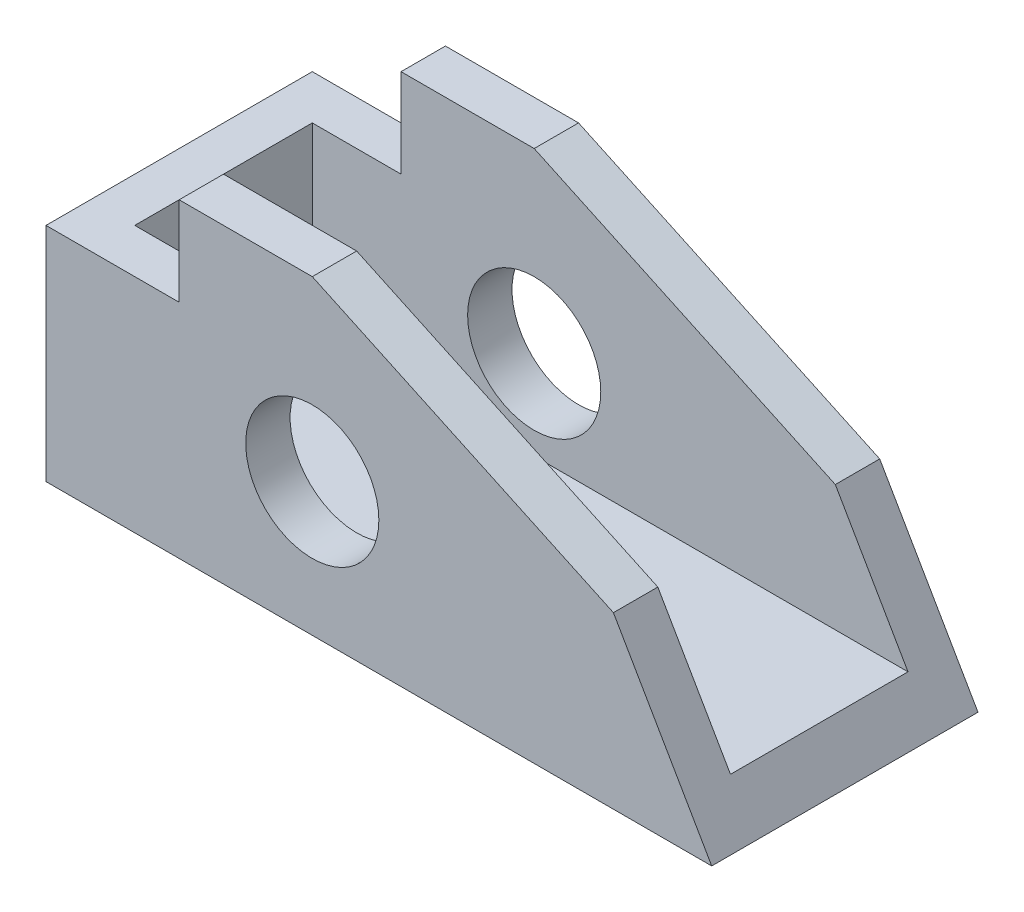
ISO-10303-21;
HEADER;
FILE_DESCRIPTION(('STEP AP214'),'2;1');
FILE_NAME('part.step','',(''),(''),'','','');
FILE_SCHEMA(('AUTOMOTIVE_DESIGN { 1 0 10303 214 1 1 1 1 }'));
ENDSEC;
DATA;
#1=APPLICATION_CONTEXT('core data for automotive mechanical design processes');
#2=APPLICATION_PROTOCOL_DEFINITION('international standard','automotive_design',2000,#1);
#3=PRODUCT_CONTEXT('',#1,'mechanical');
#4=PRODUCT('Part','Part','',(#3));
#5=PRODUCT_RELATED_PRODUCT_CATEGORY('part','',(#4));
#6=PRODUCT_DEFINITION_FORMATION('','',#4);
#7=PRODUCT_DEFINITION_CONTEXT('part definition',#1,'design');
#8=PRODUCT_DEFINITION('design','',#6,#7);
#9=PRODUCT_DEFINITION_SHAPE('','',#8);
#10=(LENGTH_UNIT() NAMED_UNIT(*) SI_UNIT(.MILLI.,.METRE.));
#11=(NAMED_UNIT(*) PLANE_ANGLE_UNIT() SI_UNIT($,.RADIAN.));
#12=(NAMED_UNIT(*) SI_UNIT($,.STERADIAN.) SOLID_ANGLE_UNIT());
#13=UNCERTAINTY_MEASURE_WITH_UNIT(LENGTH_MEASURE(1.E-05),#10,'distance_accuracy_value','');
#14=(GEOMETRIC_REPRESENTATION_CONTEXT(3) GLOBAL_UNCERTAINTY_ASSIGNED_CONTEXT((#13)) GLOBAL_UNIT_ASSIGNED_CONTEXT((#10,
#11,#12)) REPRESENTATION_CONTEXT('',''));
#15=CARTESIAN_POINT('',(0.,0.,0.));
#16=DIRECTION('',(0.,0.,1.));
#17=DIRECTION('',(1.,0.,0.));
#18=AXIS2_PLACEMENT_3D('',#15,#16,#17);
#19=CARTESIAN_POINT('',(0.,44.45,0.));
#20=DIRECTION('',(0.,-1.,0.));
#21=DIRECTION('',(0.,0.,-1.));
#22=AXIS2_PLACEMENT_3D('',#19,#20,#21);
#23=PLANE('',#22);
#24=DIRECTION('',(0.,0.,-1.));
#25=VECTOR('',#24,1.);
#26=CARTESIAN_POINT('',(19.05,44.45,-38.1));
#27=LINE('',#26,#25);
#28=CARTESIAN_POINT('',(19.05,44.45,-31.75));
#29=VERTEX_POINT('',#28);
#30=CARTESIAN_POINT('',(19.05,44.45,-38.1));
#31=VERTEX_POINT('',#30);
#32=EDGE_CURVE('E199',#29,#31,#27,.T.);
#33=ORIENTED_EDGE('',*,*,#32,.F.);
#34=DIRECTION('',(-1.,0.,0.));
#35=VECTOR('',#34,1.);
#36=CARTESIAN_POINT('',(6.35,44.45,-31.75));
#37=LINE('',#36,#35);
#38=CARTESIAN_POINT('',(38.1,44.45,-31.75));
#39=VERTEX_POINT('',#38);
#40=EDGE_CURVE('E154',#39,#29,#37,.T.);
#41=ORIENTED_EDGE('',*,*,#40,.F.);
#42=DIRECTION('',(0.,0.,1.));
#43=VECTOR('',#42,1.);
#44=CARTESIAN_POINT('',(38.1,44.45,-38.101));
#45=LINE('',#44,#43);
#46=CARTESIAN_POINT('',(38.1,44.45,-38.1));
#47=VERTEX_POINT('',#46);
#48=EDGE_CURVE('E194',#47,#39,#45,.T.);
#49=ORIENTED_EDGE('',*,*,#48,.F.);
#50=DIRECTION('',(-1.,0.,0.));
#51=VECTOR('',#50,1.);
#52=CARTESIAN_POINT('',(0.,44.45,-38.1));
#53=LINE('',#52,#51);
#54=EDGE_CURVE('E229',#47,#31,#53,.T.);
#55=ORIENTED_EDGE('',*,*,#54,.T.);
#56=EDGE_LOOP('',(#33,#41,#49,#55));
#57=FACE_BOUND('',#56,.T.);
#58=ADVANCED_FACE('F33',(#57),#23,.F.);
#59=CARTESIAN_POINT('',(38.1,19.05,0.));
#60=DIRECTION('',(0.,0.,1.));
#61=DIRECTION('',(1.,0.,0.));
#62=AXIS2_PLACEMENT_3D('',#59,#60,#61);
#63=CYLINDRICAL_SURFACE('',#62,9.525);
#64=CARTESIAN_POINT('',(38.1,19.05,-31.75));
#65=DIRECTION('',(0.,0.,-1.));
#66=DIRECTION('',(-1.,0.,0.));
#67=AXIS2_PLACEMENT_3D('',#64,#65,#66);
#68=CIRCLE('',#67,9.525);
#69=CARTESIAN_POINT('',(28.575,19.05,-31.75));
#70=VERTEX_POINT('',#69);
#71=EDGE_CURVE('E181',#70,#70,#68,.F.);
#72=ORIENTED_EDGE('',*,*,#71,.T.);
#73=EDGE_LOOP('',(#72));
#74=FACE_BOUND('',#73,.T.);
#75=CARTESIAN_POINT('',(38.1,19.05,-38.1));
#76=DIRECTION('',(0.,0.,1.));
#77=DIRECTION('',(1.,0.,0.));
#78=AXIS2_PLACEMENT_3D('',#75,#76,#77);
#79=CIRCLE('',#78,9.52499999999999);
#80=CARTESIAN_POINT('',(47.625,19.05,-38.1));
#81=VERTEX_POINT('',#80);
#82=EDGE_CURVE('E222',#81,#81,#79,.T.);
#83=ORIENTED_EDGE('',*,*,#82,.F.);
#84=EDGE_LOOP('',(#83));
#85=FACE_BOUND('',#84,.T.);
#86=ADVANCED_FACE('F306',(#74,#85),#63,.F.);
#87=CARTESIAN_POINT('',(19.05,31.75,-38.1));
#88=DIRECTION('',(1.,0.,0.));
#89=DIRECTION('',(0.,0.,-1.));
#90=AXIS2_PLACEMENT_3D('',#87,#88,#89);
#91=PLANE('',#90);
#92=DIRECTION('',(0.,0.,-1.));
#93=VECTOR('',#92,1.);
#94=CARTESIAN_POINT('',(19.05,31.75,-38.1));
#95=LINE('',#94,#93);
#96=CARTESIAN_POINT('',(19.05,31.75,-31.75));
#97=VERTEX_POINT('',#96);
#98=CARTESIAN_POINT('',(19.05,31.75,-38.1));
#99=VERTEX_POINT('',#98);
#100=EDGE_CURVE('E206',#97,#99,#95,.T.);
#101=ORIENTED_EDGE('',*,*,#100,.F.);
#102=DIRECTION('',(0.,1.,0.));
#103=VECTOR('',#102,1.);
#104=CARTESIAN_POINT('',(19.05,31.75,-31.75));
#105=LINE('',#104,#103);
#106=EDGE_CURVE('E178',#97,#29,#105,.T.);
#107=ORIENTED_EDGE('',*,*,#106,.T.);
#108=ORIENTED_EDGE('',*,*,#32,.T.);
#109=DIRECTION('',(0.,1.,0.));
#110=VECTOR('',#109,1.);
#111=CARTESIAN_POINT('',(19.05,31.75,-38.1));
#112=LINE('',#111,#110);
#113=EDGE_CURVE('E215',#99,#31,#112,.T.);
#114=ORIENTED_EDGE('',*,*,#113,.F.);
#115=EDGE_LOOP('',(#101,#107,#108,#114));
#116=FACE_BOUND('',#115,.T.);
#117=ADVANCED_FACE('F268',(#116),#91,.F.);
#118=CARTESIAN_POINT('',(38.1,44.45,-38.101));
#119=DIRECTION('',(-0.4226182617407,-0.90630778703665,0.));
#120=DIRECTION('',(0.90630778703665,-0.4226182617407,0.));
#121=AXIS2_PLACEMENT_3D('',#118,#119,#120);
#122=PLANE('',#121);
#123=ORIENTED_EDGE('',*,*,#48,.T.);
#124=DIRECTION('',(0.90630778703665,-0.4226182617407,0.));
#125=VECTOR('',#124,1.);
#126=CARTESIAN_POINT('',(38.1,44.45,-31.75));
#127=LINE('',#126,#125);
#128=CARTESIAN_POINT('',(81.1867065548134,24.3583387688133,-31.75));
#129=VERTEX_POINT('',#128);
#130=EDGE_CURVE('E173',#39,#129,#127,.T.);
#131=ORIENTED_EDGE('',*,*,#130,.T.);
#132=DIRECTION('',(0.,0.,1.));
#133=VECTOR('',#132,1.);
#134=CARTESIAN_POINT('',(81.1867065548134,24.3583387688133,-38.101));
#135=LINE('',#134,#133);
#136=CARTESIAN_POINT('',(81.1867065548134,24.3583387688133,-38.1));
#137=VERTEX_POINT('',#136);
#138=EDGE_CURVE('E185',#137,#129,#135,.T.);
#139=ORIENTED_EDGE('',*,*,#138,.F.);
#140=DIRECTION('',(-0.90630778703665,0.4226182617407,0.));
#141=VECTOR('',#140,1.);
#142=CARTESIAN_POINT('',(38.1,44.45,-38.1));
#143=LINE('',#142,#141);
#144=EDGE_CURVE('E197',#137,#47,#143,.T.);
#145=ORIENTED_EDGE('',*,*,#144,.T.);
#146=EDGE_LOOP('',(#123,#131,#139,#145));
#147=FACE_BOUND('',#146,.T.);
#148=ADVANCED_FACE('F255',(#147),#122,.F.);
#149=CARTESIAN_POINT('',(0.,44.45,0.));
#150=DIRECTION('',(1.,0.,0.));
#151=DIRECTION('',(0.,0.,-1.));
#152=AXIS2_PLACEMENT_3D('',#149,#150,#151);
#153=PLANE('',#152);
#154=DIRECTION('',(0.,0.,1.));
#155=VECTOR('',#154,1.);
#156=CARTESIAN_POINT('',(0.,31.75,-38.1));
#157=LINE('',#156,#155);
#158=CARTESIAN_POINT('',(0.,31.75,-38.1));
#159=VERTEX_POINT('',#158);
#160=CARTESIAN_POINT('',(0.,31.75,0.));
#161=VERTEX_POINT('',#160);
#162=EDGE_CURVE('E200',#159,#161,#157,.T.);
#163=ORIENTED_EDGE('',*,*,#162,.F.);
#164=DIRECTION('',(0.,-1.,0.));
#165=VECTOR('',#164,1.);
#166=CARTESIAN_POINT('',(0.,44.45,-38.1));
#167=LINE('',#166,#165);
#168=CARTESIAN_POINT('',(0.,0.,-38.1));
#169=VERTEX_POINT('',#168);
#170=EDGE_CURVE('E233',#159,#169,#167,.T.);
#171=ORIENTED_EDGE('',*,*,#170,.T.);
#172=DIRECTION('',(0.,0.,1.));
#173=VECTOR('',#172,1.);
#174=CARTESIAN_POINT('',(0.,0.,0.));
#175=LINE('',#174,#173);
#176=CARTESIAN_POINT('',(0.,0.,0.));
#177=VERTEX_POINT('',#176);
#178=EDGE_CURVE('E225',#169,#177,#175,.T.);
#179=ORIENTED_EDGE('',*,*,#178,.T.);
#180=DIRECTION('',(0.,-1.,0.));
#181=VECTOR('',#180,1.);
#182=CARTESIAN_POINT('',(0.,44.45,0.));
#183=LINE('',#182,#181);
#184=EDGE_CURVE('E244',#161,#177,#183,.T.);
#185=ORIENTED_EDGE('',*,*,#184,.F.);
#186=EDGE_LOOP('',(#163,#171,#179,#185));
#187=FACE_BOUND('',#186,.T.);
#188=ADVANCED_FACE('F35',(#187),#153,.F.);
#189=CARTESIAN_POINT('',(0.,44.45,0.));
#190=DIRECTION('',(0.,0.,-1.));
#191=DIRECTION('',(-1.,0.,0.));
#192=AXIS2_PLACEMENT_3D('',#189,#190,#191);
#193=PLANE('',#192);
#194=CARTESIAN_POINT('',(38.1,19.05,0.));
#195=DIRECTION('',(0.,0.,1.));
#196=DIRECTION('',(1.,0.,0.));
#197=AXIS2_PLACEMENT_3D('',#194,#195,#196);
#198=CIRCLE('',#197,9.525);
#199=CARTESIAN_POINT('',(47.625,19.05,0.));
#200=VERTEX_POINT('',#199);
#201=EDGE_CURVE('E218',#200,#200,#198,.T.);
#202=ORIENTED_EDGE('',*,*,#201,.F.);
#203=EDGE_LOOP('',(#202));
#204=FACE_BOUND('',#203,.T.);
#205=DIRECTION('',(1.,0.,0.));
#206=VECTOR('',#205,1.);
#207=CARTESIAN_POINT('',(0.,0.,0.));
#208=LINE('',#207,#206);
#209=CARTESIAN_POINT('',(95.25,0.,0.));
#210=VERTEX_POINT('',#209);
#211=EDGE_CURVE('E236',#177,#210,#208,.T.);
#212=ORIENTED_EDGE('',*,*,#211,.T.);
#213=DIRECTION('',(0.500000000000004,-0.866025403784436,0.));
#214=VECTOR('',#213,1.);
#215=CARTESIAN_POINT('',(95.25,0.,0.));
#216=LINE('',#215,#214);
#217=CARTESIAN_POINT('',(81.1867065548134,24.3583387688133,0.));
#218=VERTEX_POINT('',#217);
#219=EDGE_CURVE('E188',#218,#210,#216,.T.);
#220=ORIENTED_EDGE('',*,*,#219,.F.);
#221=DIRECTION('',(0.906307787036649,-0.4226182617407,0.));
#222=VECTOR('',#221,1.);
#223=CARTESIAN_POINT('',(38.1,44.45,0.));
#224=LINE('',#223,#222);
#225=CARTESIAN_POINT('',(38.1,44.45,0.));
#226=VERTEX_POINT('',#225);
#227=EDGE_CURVE('E190',#226,#218,#224,.T.);
#228=ORIENTED_EDGE('',*,*,#227,.F.);
#229=DIRECTION('',(1.,0.,0.));
#230=VECTOR('',#229,1.);
#231=CARTESIAN_POINT('',(0.,44.45,0.));
#232=LINE('',#231,#230);
#233=CARTESIAN_POINT('',(19.05,44.45,0.));
#234=VERTEX_POINT('',#233);
#235=EDGE_CURVE('E226',#234,#226,#232,.T.);
#236=ORIENTED_EDGE('',*,*,#235,.F.);
#237=DIRECTION('',(0.,1.,0.));
#238=VECTOR('',#237,1.);
#239=CARTESIAN_POINT('',(19.05,31.75,0.));
#240=LINE('',#239,#238);
#241=CARTESIAN_POINT('',(19.05,31.75,0.));
#242=VERTEX_POINT('',#241);
#243=EDGE_CURVE('E212',#242,#234,#240,.T.);
#244=ORIENTED_EDGE('',*,*,#243,.F.);
#245=DIRECTION('',(1.,0.,0.));
#246=VECTOR('',#245,1.);
#247=CARTESIAN_POINT('',(0.,31.75,0.));
#248=LINE('',#247,#246);
#249=EDGE_CURVE('E202',#161,#242,#248,.T.);
#250=ORIENTED_EDGE('',*,*,#249,.F.);
#251=ORIENTED_EDGE('',*,*,#184,.T.);
#252=EDGE_LOOP('',(#212,#220,#228,#236,#244,#250,#251));
#253=FACE_BOUND('',#252,.T.);
#254=ADVANCED_FACE('F283',(#204,#253),#193,.F.);
#255=CARTESIAN_POINT('',(0.,44.45,-38.1));
#256=DIRECTION('',(0.,0.,1.));
#257=DIRECTION('',(1.,0.,0.));
#258=AXIS2_PLACEMENT_3D('',#255,#256,#257);
#259=PLANE('',#258);
#260=ORIENTED_EDGE('',*,*,#82,.T.);
#261=EDGE_LOOP('',(#260));
#262=FACE_BOUND('',#261,.T.);
#263=ORIENTED_EDGE('',*,*,#144,.F.);
#264=DIRECTION('',(-0.500000000000004,0.866025403784436,0.));
#265=VECTOR('',#264,1.);
#266=CARTESIAN_POINT('',(95.25,0.,-38.1));
#267=LINE('',#266,#265);
#268=CARTESIAN_POINT('',(95.25,0.,-38.1));
#269=VERTEX_POINT('',#268);
#270=EDGE_CURVE('E56',#269,#137,#267,.T.);
#271=ORIENTED_EDGE('',*,*,#270,.F.);
#272=DIRECTION('',(-1.,0.,0.));
#273=VECTOR('',#272,1.);
#274=CARTESIAN_POINT('',(0.,0.,-38.1));
#275=LINE('',#274,#273);
#276=EDGE_CURVE('E230',#269,#169,#275,.T.);
#277=ORIENTED_EDGE('',*,*,#276,.T.);
#278=ORIENTED_EDGE('',*,*,#170,.F.);
#279=DIRECTION('',(-1.,0.,0.));
#280=VECTOR('',#279,1.);
#281=CARTESIAN_POINT('',(0.,31.75,-38.1));
#282=LINE('',#281,#280);
#283=EDGE_CURVE('E210',#99,#159,#282,.T.);
#284=ORIENTED_EDGE('',*,*,#283,.F.);
#285=ORIENTED_EDGE('',*,*,#113,.T.);
#286=ORIENTED_EDGE('',*,*,#54,.F.);
#287=EDGE_LOOP('',(#263,#271,#277,#278,#284,#285,#286));
#288=FACE_BOUND('',#287,.T.);
#289=ADVANCED_FACE('F262',(#262,#288),#259,.F.);
#290=CARTESIAN_POINT('',(38.1,44.45,-6.35));
#291=VERTEX_POINT('',#290);
#292=EDGE_CURVE('E193',#291,#226,#45,.T.);
#293=ORIENTED_EDGE('',*,*,#292,.F.);
#294=DIRECTION('',(1.,0.,0.));
#295=VECTOR('',#294,1.);
#296=CARTESIAN_POINT('',(6.35,44.45,-6.35));
#297=LINE('',#296,#295);
#298=CARTESIAN_POINT('',(19.05,44.45,-6.35));
#299=VERTEX_POINT('',#298);
#300=EDGE_CURVE('E156',#299,#291,#297,.T.);
#301=ORIENTED_EDGE('',*,*,#300,.F.);
#302=EDGE_CURVE('E203',#234,#299,#27,.T.);
#303=ORIENTED_EDGE('',*,*,#302,.F.);
#304=ORIENTED_EDGE('',*,*,#235,.T.);
#305=EDGE_LOOP('',(#293,#301,#303,#304));
#306=FACE_BOUND('',#305,.T.);
#307=ADVANCED_FACE('F280',(#306),#23,.F.);
#308=CARTESIAN_POINT('',(0.,0.,0.));
#309=DIRECTION('',(0.,-1.,0.));
#310=DIRECTION('',(0.,0.,-1.));
#311=AXIS2_PLACEMENT_3D('',#308,#309,#310);
#312=PLANE('',#311);
#313=ORIENTED_EDGE('',*,*,#178,.F.);
#314=ORIENTED_EDGE('',*,*,#276,.F.);
#315=DIRECTION('',(0.,0.,-1.));
#316=VECTOR('',#315,1.);
#317=CARTESIAN_POINT('',(95.25,0.,0.));
#318=LINE('',#317,#316);
#319=EDGE_CURVE('E239',#210,#269,#318,.T.);
#320=ORIENTED_EDGE('',*,*,#319,.F.);
#321=ORIENTED_EDGE('',*,*,#211,.F.);
#322=EDGE_LOOP('',(#313,#314,#320,#321));
#323=FACE_BOUND('',#322,.T.);
#324=ADVANCED_FACE('F295',(#323),#312,.T.);
#325=CARTESIAN_POINT('',(38.1,19.05,-6.35));
#326=DIRECTION('',(0.,0.,1.));
#327=DIRECTION('',(1.,0.,0.));
#328=AXIS2_PLACEMENT_3D('',#325,#326,#327);
#329=CIRCLE('',#328,9.525);
#330=CARTESIAN_POINT('',(47.625,19.05,-6.35));
#331=VERTEX_POINT('',#330);
#332=EDGE_CURVE('E170',#331,#331,#329,.F.);
#333=ORIENTED_EDGE('',*,*,#332,.T.);
#334=EDGE_LOOP('',(#333));
#335=FACE_BOUND('',#334,.T.);
#336=ORIENTED_EDGE('',*,*,#201,.T.);
#337=EDGE_LOOP('',(#336));
#338=FACE_BOUND('',#337,.T.);
#339=ADVANCED_FACE('F313',(#335,#338),#63,.F.);
#340=ORIENTED_EDGE('',*,*,#302,.T.);
#341=DIRECTION('',(0.,-1.,0.));
#342=VECTOR('',#341,1.);
#343=CARTESIAN_POINT('',(19.05,31.75,-6.35));
#344=LINE('',#343,#342);
#345=CARTESIAN_POINT('',(19.05,31.75,-6.35));
#346=VERTEX_POINT('',#345);
#347=EDGE_CURVE('E167',#299,#346,#344,.T.);
#348=ORIENTED_EDGE('',*,*,#347,.T.);
#349=EDGE_CURVE('E207',#242,#346,#95,.T.);
#350=ORIENTED_EDGE('',*,*,#349,.F.);
#351=ORIENTED_EDGE('',*,*,#243,.T.);
#352=EDGE_LOOP('',(#340,#348,#350,#351));
#353=FACE_BOUND('',#352,.T.);
#354=ADVANCED_FACE('F274',(#353),#91,.F.);
#355=CARTESIAN_POINT('',(0.,31.75,0.));
#356=DIRECTION('',(0.,1.,0.));
#357=DIRECTION('',(0.,0.,1.));
#358=AXIS2_PLACEMENT_3D('',#355,#356,#357);
#359=PLANE('',#358);
#360=DIRECTION('',(-1.,0.,0.));
#361=VECTOR('',#360,1.);
#362=CARTESIAN_POINT('',(0.,31.75,-31.75));
#363=LINE('',#362,#361);
#364=CARTESIAN_POINT('',(6.35,31.75,-31.75));
#365=VERTEX_POINT('',#364);
#366=EDGE_CURVE('E176',#97,#365,#363,.T.);
#367=ORIENTED_EDGE('',*,*,#366,.F.);
#368=ORIENTED_EDGE('',*,*,#100,.T.);
#369=ORIENTED_EDGE('',*,*,#283,.T.);
#370=ORIENTED_EDGE('',*,*,#162,.T.);
#371=ORIENTED_EDGE('',*,*,#249,.T.);
#372=ORIENTED_EDGE('',*,*,#349,.T.);
#373=DIRECTION('',(1.,0.,0.));
#374=VECTOR('',#373,1.);
#375=CARTESIAN_POINT('',(0.,31.75,-6.35));
#376=LINE('',#375,#374);
#377=CARTESIAN_POINT('',(6.35,31.75,-6.35));
#378=VERTEX_POINT('',#377);
#379=EDGE_CURVE('E165',#378,#346,#376,.T.);
#380=ORIENTED_EDGE('',*,*,#379,.F.);
#381=DIRECTION('',(0.,0.,1.));
#382=VECTOR('',#381,1.);
#383=CARTESIAN_POINT('',(6.35,31.75,0.));
#384=LINE('',#383,#382);
#385=EDGE_CURVE('E11',#365,#378,#384,.T.);
#386=ORIENTED_EDGE('',*,*,#385,.F.);
#387=EDGE_LOOP('',(#367,#368,#369,#370,#371,#372,#380,#386));
#388=FACE_BOUND('',#387,.T.);
#389=ADVANCED_FACE('F271',(#388),#359,.T.);
#390=CARTESIAN_POINT('',(81.1867065548134,24.3583387688133,-6.35));
#391=VERTEX_POINT('',#390);
#392=EDGE_CURVE('E184',#391,#218,#135,.T.);
#393=ORIENTED_EDGE('',*,*,#392,.F.);
#394=DIRECTION('',(-0.90630778703665,0.4226182617407,0.));
#395=VECTOR('',#394,1.);
#396=CARTESIAN_POINT('',(38.1,44.45,-6.35));
#397=LINE('',#396,#395);
#398=EDGE_CURVE('E161',#391,#291,#397,.T.);
#399=ORIENTED_EDGE('',*,*,#398,.T.);
#400=ORIENTED_EDGE('',*,*,#292,.T.);
#401=ORIENTED_EDGE('',*,*,#227,.T.);
#402=EDGE_LOOP('',(#393,#399,#400,#401));
#403=FACE_BOUND('',#402,.T.);
#404=ADVANCED_FACE('F288',(#403),#122,.F.);
#405=CARTESIAN_POINT('',(95.25,0.,-38.101));
#406=DIRECTION('',(-0.866025403784436,-0.500000000000004,0.));
#407=DIRECTION('',(0.500000000000004,-0.866025403784436,0.));
#408=AXIS2_PLACEMENT_3D('',#405,#406,#407);
#409=PLANE('',#408);
#410=ORIENTED_EDGE('',*,*,#138,.T.);
#411=DIRECTION('',(0.500000000000004,-0.866025403784436,0.));
#412=VECTOR('',#411,1.);
#413=CARTESIAN_POINT('',(95.25,0.,-31.75));
#414=LINE('',#413,#412);
#415=CARTESIAN_POINT('',(91.5838257906458,6.34999999999999,-31.75));
#416=VERTEX_POINT('',#415);
#417=EDGE_CURVE('E41',#129,#416,#414,.T.);
#418=ORIENTED_EDGE('',*,*,#417,.T.);
#419=DIRECTION('',(0.,0.,-1.));
#420=VECTOR('',#419,1.);
#421=CARTESIAN_POINT('',(91.5838257906458,6.34999999999999,-38.101));
#422=LINE('',#421,#420);
#423=CARTESIAN_POINT('',(91.5838257906458,6.34999999999999,-6.35));
#424=VERTEX_POINT('',#423);
#425=EDGE_CURVE('E246',#424,#416,#422,.T.);
#426=ORIENTED_EDGE('',*,*,#425,.F.);
#427=DIRECTION('',(-0.500000000000004,0.866025403784436,0.));
#428=VECTOR('',#427,1.);
#429=CARTESIAN_POINT('',(95.25,0.,-6.35));
#430=LINE('',#429,#428);
#431=EDGE_CURVE('E148',#424,#391,#430,.T.);
#432=ORIENTED_EDGE('',*,*,#431,.T.);
#433=ORIENTED_EDGE('',*,*,#392,.T.);
#434=ORIENTED_EDGE('',*,*,#219,.T.);
#435=ORIENTED_EDGE('',*,*,#319,.T.);
#436=ORIENTED_EDGE('',*,*,#270,.T.);
#437=EDGE_LOOP('',(#410,#418,#426,#432,#433,#434,#435,#436));
#438=FACE_BOUND('',#437,.T.);
#439=ADVANCED_FACE('F249',(#438),#409,.F.);
#440=CARTESIAN_POINT('',(6.35,6.34999999999999,-31.75));
#441=DIRECTION('',(0.,0.,-1.));
#442=DIRECTION('',(-1.,0.,0.));
#443=AXIS2_PLACEMENT_3D('',#440,#441,#442);
#444=PLANE('',#443);
#445=ORIENTED_EDGE('',*,*,#366,.T.);
#446=DIRECTION('',(0.,1.,0.));
#447=VECTOR('',#446,1.);
#448=CARTESIAN_POINT('',(6.35,6.34999999999999,-31.75));
#449=LINE('',#448,#447);
#450=CARTESIAN_POINT('',(6.35,6.34999999999999,-31.75));
#451=VERTEX_POINT('',#450);
#452=EDGE_CURVE('E142',#451,#365,#449,.T.);
#453=ORIENTED_EDGE('',*,*,#452,.F.);
#454=DIRECTION('',(-1.,0.,0.));
#455=VECTOR('',#454,1.);
#456=CARTESIAN_POINT('',(6.35,6.34999999999999,-31.75));
#457=LINE('',#456,#455);
#458=EDGE_CURVE('E143',#416,#451,#457,.T.);
#459=ORIENTED_EDGE('',*,*,#458,.F.);
#460=ORIENTED_EDGE('',*,*,#417,.F.);
#461=ORIENTED_EDGE('',*,*,#130,.F.);
#462=ORIENTED_EDGE('',*,*,#40,.T.);
#463=ORIENTED_EDGE('',*,*,#106,.F.);
#464=EDGE_LOOP('',(#445,#453,#459,#460,#461,#462,#463));
#465=FACE_BOUND('',#464,.T.);
#466=ORIENTED_EDGE('',*,*,#71,.F.);
#467=EDGE_LOOP('',(#466));
#468=FACE_BOUND('',#467,.T.);
#469=ADVANCED_FACE('F251',(#465,#468),#444,.F.);
#470=CARTESIAN_POINT('',(6.35,6.34999999999999,-6.35));
#471=DIRECTION('',(0.,0.,1.));
#472=DIRECTION('',(1.,0.,0.));
#473=AXIS2_PLACEMENT_3D('',#470,#471,#472);
#474=PLANE('',#473);
#475=ORIENTED_EDGE('',*,*,#300,.T.);
#476=ORIENTED_EDGE('',*,*,#398,.F.);
#477=ORIENTED_EDGE('',*,*,#431,.F.);
#478=DIRECTION('',(1.,0.,0.));
#479=VECTOR('',#478,1.);
#480=CARTESIAN_POINT('',(6.35,6.34999999999999,-6.35));
#481=LINE('',#480,#479);
#482=CARTESIAN_POINT('',(6.35,6.34999999999999,-6.35));
#483=VERTEX_POINT('',#482);
#484=EDGE_CURVE('E48',#483,#424,#481,.T.);
#485=ORIENTED_EDGE('',*,*,#484,.F.);
#486=DIRECTION('',(0.,1.,0.));
#487=VECTOR('',#486,1.);
#488=CARTESIAN_POINT('',(6.35,6.34999999999999,-6.35));
#489=LINE('',#488,#487);
#490=EDGE_CURVE('E135',#483,#378,#489,.T.);
#491=ORIENTED_EDGE('',*,*,#490,.T.);
#492=ORIENTED_EDGE('',*,*,#379,.T.);
#493=ORIENTED_EDGE('',*,*,#347,.F.);
#494=EDGE_LOOP('',(#475,#476,#477,#485,#491,#492,#493));
#495=FACE_BOUND('',#494,.T.);
#496=ORIENTED_EDGE('',*,*,#332,.F.);
#497=EDGE_LOOP('',(#496));
#498=FACE_BOUND('',#497,.T.);
#499=ADVANCED_FACE('F145',(#495,#498),#474,.F.);
#500=CARTESIAN_POINT('',(0.,6.34999999999999,0.));
#501=DIRECTION('',(0.,1.,0.));
#502=DIRECTION('',(0.,0.,1.));
#503=AXIS2_PLACEMENT_3D('',#500,#501,#502);
#504=PLANE('',#503);
#505=ORIENTED_EDGE('',*,*,#425,.T.);
#506=ORIENTED_EDGE('',*,*,#458,.T.);
#507=DIRECTION('',(0.,0.,1.));
#508=VECTOR('',#507,1.);
#509=CARTESIAN_POINT('',(6.35,6.34999999999999,-31.75));
#510=LINE('',#509,#508);
#511=EDGE_CURVE('E138',#451,#483,#510,.T.);
#512=ORIENTED_EDGE('',*,*,#511,.T.);
#513=ORIENTED_EDGE('',*,*,#484,.T.);
#514=EDGE_LOOP('',(#505,#506,#512,#513));
#515=FACE_BOUND('',#514,.T.);
#516=ADVANCED_FACE('F151',(#515),#504,.T.);
#517=CARTESIAN_POINT('',(6.35,6.34999999999999,-31.75));
#518=DIRECTION('',(-1.,0.,0.));
#519=DIRECTION('',(0.,0.,1.));
#520=AXIS2_PLACEMENT_3D('',#517,#518,#519);
#521=PLANE('',#520);
#522=ORIENTED_EDGE('',*,*,#385,.T.);
#523=ORIENTED_EDGE('',*,*,#490,.F.);
#524=ORIENTED_EDGE('',*,*,#511,.F.);
#525=ORIENTED_EDGE('',*,*,#452,.T.);
#526=EDGE_LOOP('',(#522,#523,#524,#525));
#527=FACE_BOUND('',#526,.T.);
#528=ADVANCED_FACE('F136',(#527),#521,.F.);
#529=CLOSED_SHELL('',(#58,#86,#117,#148,#188,#254,#289,#307,#324,#339,#354,#389,#404,#439,#469,
#499,#516,#528));
#530=MANIFOLD_SOLID_BREP('B2',#529);
#531=ADVANCED_BREP_SHAPE_REPRESENTATION('',(#18,#530),#14);
#532=SHAPE_DEFINITION_REPRESENTATION(#9,#531);
ENDSEC;
END-ISO-10303-21;
